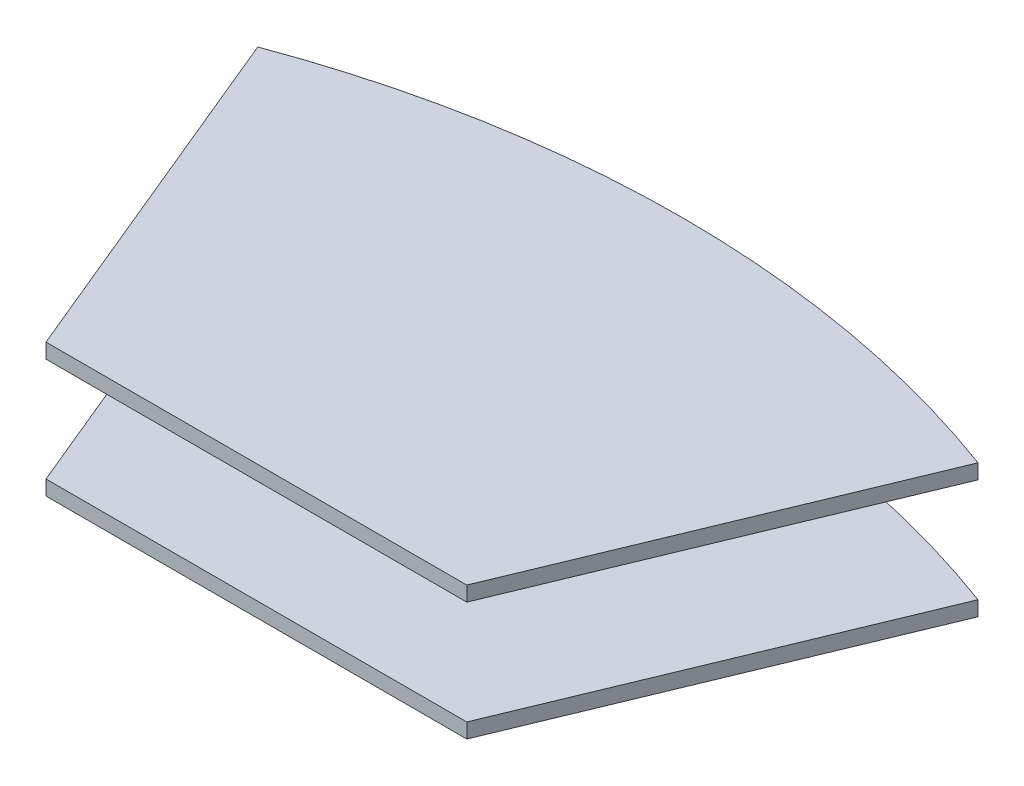
ISO-10303-21;
HEADER;
FILE_DESCRIPTION(('STEP AP214'),'2;1');
FILE_NAME('part.step','',(''),(''),'','','');
FILE_SCHEMA(('AUTOMOTIVE_DESIGN { 1 0 10303 214 1 1 1 1 }'));
ENDSEC;
DATA;
#1=APPLICATION_CONTEXT('core data for automotive mechanical design processes');
#2=APPLICATION_PROTOCOL_DEFINITION('international standard','automotive_design',2000,#1);
#3=PRODUCT_CONTEXT('',#1,'mechanical');
#4=PRODUCT('Part','Part','',(#3));
#5=PRODUCT_RELATED_PRODUCT_CATEGORY('part','',(#4));
#6=PRODUCT_DEFINITION_FORMATION('','',#4);
#7=PRODUCT_DEFINITION_CONTEXT('part definition',#1,'design');
#8=PRODUCT_DEFINITION('design','',#6,#7);
#9=PRODUCT_DEFINITION_SHAPE('','',#8);
#10=(LENGTH_UNIT() NAMED_UNIT(*) SI_UNIT(.MILLI.,.METRE.));
#11=(NAMED_UNIT(*) PLANE_ANGLE_UNIT() SI_UNIT($,.RADIAN.));
#12=(NAMED_UNIT(*) SI_UNIT($,.STERADIAN.) SOLID_ANGLE_UNIT());
#13=UNCERTAINTY_MEASURE_WITH_UNIT(LENGTH_MEASURE(1.E-05),#10,'distance_accuracy_value','');
#14=(GEOMETRIC_REPRESENTATION_CONTEXT(3) GLOBAL_UNCERTAINTY_ASSIGNED_CONTEXT((#13)) GLOBAL_UNIT_ASSIGNED_CONTEXT((#10,
#11,#12)) REPRESENTATION_CONTEXT('',''));
#15=CARTESIAN_POINT('',(0.,0.,0.));
#16=DIRECTION('',(0.,0.,1.));
#17=DIRECTION('',(1.,0.,0.));
#18=AXIS2_PLACEMENT_3D('',#15,#16,#17);
#19=CARTESIAN_POINT('',(0.,5.,281.282193031035));
#20=DIRECTION('',(0.,-1.,0.));
#21=DIRECTION('',(0.,0.,-1.));
#22=AXIS2_PLACEMENT_3D('',#19,#20,#21);
#23=CYLINDRICAL_SURFACE('',#22,350.);
#24=CARTESIAN_POINT('',(0.,0.,281.282193031035));
#25=DIRECTION('',(0.,1.,0.));
#26=DIRECTION('',(0.,0.,-1.));
#27=AXIS2_PLACEMENT_3D('',#24,#25,#26);
#28=CIRCLE('',#27,350.);
#29=CARTESIAN_POINT('',(121.5,0.,-46.9520982914898));
#30=VERTEX_POINT('',#29);
#31=CARTESIAN_POINT('',(-121.5,0.,-46.9520982914898));
#32=VERTEX_POINT('',#31);
#33=EDGE_CURVE('E239',#30,#32,#28,.T.);
#34=ORIENTED_EDGE('',*,*,#33,.T.);
#35=DIRECTION('',(0.,-1.,0.));
#36=VECTOR('',#35,1.);
#37=CARTESIAN_POINT('',(-121.5,5.,-46.9520982914898));
#38=LINE('',#37,#36);
#39=CARTESIAN_POINT('',(-121.5,5.,-46.9520982914898));
#40=VERTEX_POINT('',#39);
#41=EDGE_CURVE('E11',#40,#32,#38,.T.);
#42=ORIENTED_EDGE('',*,*,#41,.F.);
#43=CARTESIAN_POINT('',(0.,5.,281.282193031035));
#44=DIRECTION('',(0.,1.,0.));
#45=DIRECTION('',(0.,0.,-1.));
#46=AXIS2_PLACEMENT_3D('',#43,#44,#45);
#47=CIRCLE('',#46,350.);
#48=CARTESIAN_POINT('',(121.5,5.,-46.9520982914898));
#49=VERTEX_POINT('',#48);
#50=EDGE_CURVE('E240',#49,#40,#47,.T.);
#51=ORIENTED_EDGE('',*,*,#50,.F.);
#52=DIRECTION('',(0.,-1.,0.));
#53=VECTOR('',#52,1.);
#54=CARTESIAN_POINT('',(121.5,5.,-46.9520982914898));
#55=LINE('',#54,#53);
#56=EDGE_CURVE('E250',#49,#30,#55,.T.);
#57=ORIENTED_EDGE('',*,*,#56,.T.);
#58=EDGE_LOOP('',(#34,#42,#51,#57));
#59=FACE_BOUND('',#58,.T.);
#60=ADVANCED_FACE('F32',(#59),#23,.T.);
#61=CARTESIAN_POINT('',(-121.5,5.,-46.9520982914898));
#62=DIRECTION('',(0.923879532511286,0.,-0.38268343236509));
#63=DIRECTION('',(-0.382683432365091,0.,-0.923879532511287));
#64=AXIS2_PLACEMENT_3D('',#61,#62,#63);
#65=PLANE('',#64);
#66=DIRECTION('',(0.38268343236509,0.,0.923879532511286));
#67=VECTOR('',#66,1.);
#68=CARTESIAN_POINT('',(-121.5,0.,-46.9520982914898));
#69=LINE('',#68,#67);
#70=CARTESIAN_POINT('',(-70.9857869278081,0.,75.));
#71=VERTEX_POINT('',#70);
#72=EDGE_CURVE('E253',#32,#71,#69,.T.);
#73=ORIENTED_EDGE('',*,*,#72,.T.);
#74=DIRECTION('',(0.,-1.,0.));
#75=VECTOR('',#74,1.);
#76=CARTESIAN_POINT('',(-70.9857869278081,5.,75.));
#77=LINE('',#76,#75);
#78=CARTESIAN_POINT('',(-70.9857869278081,5.,75.));
#79=VERTEX_POINT('',#78);
#80=EDGE_CURVE('E39',#79,#71,#77,.T.);
#81=ORIENTED_EDGE('',*,*,#80,.F.);
#82=DIRECTION('',(0.38268343236509,0.,0.923879532511286));
#83=VECTOR('',#82,1.);
#84=CARTESIAN_POINT('',(-121.5,5.,-46.9520982914898));
#85=LINE('',#84,#83);
#86=EDGE_CURVE('E243',#40,#79,#85,.T.);
#87=ORIENTED_EDGE('',*,*,#86,.F.);
#88=ORIENTED_EDGE('',*,*,#41,.T.);
#89=EDGE_LOOP('',(#73,#81,#87,#88));
#90=FACE_BOUND('',#89,.T.);
#91=ADVANCED_FACE('F283',(#90),#65,.F.);
#92=CARTESIAN_POINT('',(-70.9857869278081,5.,75.));
#93=DIRECTION('',(0.,0.,-1.));
#94=DIRECTION('',(-1.,0.,0.));
#95=AXIS2_PLACEMENT_3D('',#92,#93,#94);
#96=PLANE('',#95);
#97=DIRECTION('',(1.,0.,0.));
#98=VECTOR('',#97,1.);
#99=CARTESIAN_POINT('',(-70.9857869278081,0.,75.));
#100=LINE('',#99,#98);
#101=CARTESIAN_POINT('',(70.9857869278081,0.,75.));
#102=VERTEX_POINT('',#101);
#103=EDGE_CURVE('E255',#71,#102,#100,.T.);
#104=ORIENTED_EDGE('',*,*,#103,.T.);
#105=DIRECTION('',(0.,-1.,0.));
#106=VECTOR('',#105,1.);
#107=CARTESIAN_POINT('',(70.9857869278081,5.,75.));
#108=LINE('',#107,#106);
#109=CARTESIAN_POINT('',(70.9857869278081,5.,75.));
#110=VERTEX_POINT('',#109);
#111=EDGE_CURVE('E260',#110,#102,#108,.T.);
#112=ORIENTED_EDGE('',*,*,#111,.F.);
#113=DIRECTION('',(1.,0.,0.));
#114=VECTOR('',#113,1.);
#115=CARTESIAN_POINT('',(-70.9857869278081,5.,75.));
#116=LINE('',#115,#114);
#117=EDGE_CURVE('E246',#79,#110,#116,.T.);
#118=ORIENTED_EDGE('',*,*,#117,.F.);
#119=ORIENTED_EDGE('',*,*,#80,.T.);
#120=EDGE_LOOP('',(#104,#112,#118,#119));
#121=FACE_BOUND('',#120,.T.);
#122=ADVANCED_FACE('F267',(#121),#96,.F.);
#123=CARTESIAN_POINT('',(121.5,5.,-46.9520982914898));
#124=DIRECTION('',(-0.923879532511287,0.,-0.38268343236509));
#125=DIRECTION('',(-0.38268343236509,0.,0.923879532511287));
#126=AXIS2_PLACEMENT_3D('',#123,#124,#125);
#127=PLANE('',#126);
#128=DIRECTION('',(0.38268343236509,0.,-0.923879532511287));
#129=VECTOR('',#128,1.);
#130=CARTESIAN_POINT('',(121.5,0.,-46.9520982914898));
#131=LINE('',#130,#129);
#132=EDGE_CURVE('E244',#102,#30,#131,.T.);
#133=ORIENTED_EDGE('',*,*,#132,.T.);
#134=ORIENTED_EDGE('',*,*,#56,.F.);
#135=DIRECTION('',(0.38268343236509,0.,-0.923879532511287));
#136=VECTOR('',#135,1.);
#137=CARTESIAN_POINT('',(121.5,5.,-46.9520982914898));
#138=LINE('',#137,#136);
#139=EDGE_CURVE('E248',#110,#49,#138,.T.);
#140=ORIENTED_EDGE('',*,*,#139,.F.);
#141=ORIENTED_EDGE('',*,*,#111,.T.);
#142=EDGE_LOOP('',(#133,#134,#140,#141));
#143=FACE_BOUND('',#142,.T.);
#144=ADVANCED_FACE('F276',(#143),#127,.F.);
#145=CARTESIAN_POINT('',(0.,5.,281.282193031035));
#146=DIRECTION('',(0.,-1.,0.));
#147=DIRECTION('',(0.,0.,-1.));
#148=AXIS2_PLACEMENT_3D('',#145,#146,#147);
#149=PLANE('',#148);
#150=CARTESIAN_POINT('',(39.5944346456873,5.,-6.0021273644374));
#151=DIRECTION('',(0.,1.,0.));
#152=DIRECTION('',(0.,0.,-1.));
#153=AXIS2_PLACEMENT_3D('',#150,#151,#152);
#154=CIRCLE('',#153,9.99999999999999);
#155=CARTESIAN_POINT('',(48.8332299708001,5.,-2.17529304078651));
#156=VERTEX_POINT('',#155);
#157=CARTESIAN_POINT('',(40.9597599782972,5.,-15.9084832401434));
#158=VERTEX_POINT('',#157);
#159=EDGE_CURVE('E46',#156,#158,#154,.T.);
#160=ORIENTED_EDGE('',*,*,#159,.F.);
#161=DIRECTION('',(0.38268343236509,0.,-0.923879532511287));
#162=VECTOR('',#161,1.);
#163=CARTESIAN_POINT('',(40.1338639777631,5.,18.8268343236508));
#164=LINE('',#163,#162);
#165=CARTESIAN_POINT('',(40.1338639777631,5.,18.8268343236508));
#166=VERTEX_POINT('',#165);
#167=EDGE_CURVE('E50',#166,#156,#164,.T.);
#168=ORIENTED_EDGE('',*,*,#167,.F.);
#169=CARTESIAN_POINT('',(30.8950686526502,5.,15.));
#170=DIRECTION('',(0.,1.,0.));
#171=DIRECTION('',(0.,0.,-1.));
#172=AXIS2_PLACEMENT_3D('',#169,#170,#171);
#173=CIRCLE('',#172,10.);
#174=CARTESIAN_POINT('',(30.8950686526501,5.,25.));
#175=VERTEX_POINT('',#174);
#176=EDGE_CURVE('E213',#175,#166,#173,.T.);
#177=ORIENTED_EDGE('',*,*,#176,.F.);
#178=DIRECTION('',(1.,0.,0.));
#179=VECTOR('',#178,1.);
#180=CARTESIAN_POINT('',(-30.8950686526501,5.,25.));
#181=LINE('',#180,#179);
#182=CARTESIAN_POINT('',(-30.8950686526502,5.,25.));
#183=VERTEX_POINT('',#182);
#184=EDGE_CURVE('E210',#183,#175,#181,.T.);
#185=ORIENTED_EDGE('',*,*,#184,.F.);
#186=CARTESIAN_POINT('',(-30.8950686526502,5.,15.));
#187=DIRECTION('',(0.,1.,0.));
#188=DIRECTION('',(0.,0.,1.));
#189=AXIS2_PLACEMENT_3D('',#186,#187,#188);
#190=CIRCLE('',#189,10.);
#191=CARTESIAN_POINT('',(-40.1338639777631,5.,18.8268343236508));
#192=VERTEX_POINT('',#191);
#193=EDGE_CURVE('E207',#192,#183,#190,.T.);
#194=ORIENTED_EDGE('',*,*,#193,.F.);
#195=DIRECTION('',(0.38268343236509,0.,0.923879532511287));
#196=VECTOR('',#195,1.);
#197=CARTESIAN_POINT('',(-48.8332299708002,5.,-2.17529304078656));
#198=LINE('',#197,#196);
#199=CARTESIAN_POINT('',(-48.8332299708002,5.,-2.17529304078655));
#200=VERTEX_POINT('',#199);
#201=EDGE_CURVE('E204',#200,#192,#198,.T.);
#202=ORIENTED_EDGE('',*,*,#201,.F.);
#203=CARTESIAN_POINT('',(-39.5944346456873,5.,-6.00212736443746));
#204=DIRECTION('',(0.,1.,0.));
#205=DIRECTION('',(0.,0.,-1.));
#206=AXIS2_PLACEMENT_3D('',#203,#204,#205);
#207=CIRCLE('',#206,10.);
#208=CARTESIAN_POINT('',(-40.9597599782972,5.,-15.9084832401434));
#209=VERTEX_POINT('',#208);
#210=EDGE_CURVE('E201',#209,#200,#207,.T.);
#211=ORIENTED_EDGE('',*,*,#210,.F.);
#212=CARTESIAN_POINT('',(0.,5.,281.282193031035));
#213=DIRECTION('',(0.,1.,0.));
#214=DIRECTION('',(0.,0.,1.));
#215=AXIS2_PLACEMENT_3D('',#212,#213,#214);
#216=CIRCLE('',#215,300.);
#217=EDGE_CURVE('E168',#158,#209,#216,.T.);
#218=ORIENTED_EDGE('',*,*,#217,.F.);
#219=EDGE_LOOP('',(#160,#168,#177,#185,#194,#202,#211,#218));
#220=FACE_BOUND('',#219,.T.);
#221=ORIENTED_EDGE('',*,*,#50,.T.);
#222=ORIENTED_EDGE('',*,*,#86,.T.);
#223=ORIENTED_EDGE('',*,*,#117,.T.);
#224=ORIENTED_EDGE('',*,*,#139,.T.);
#225=EDGE_LOOP('',(#221,#222,#223,#224));
#226=FACE_BOUND('',#225,.T.);
#227=ADVANCED_FACE('F282',(#220,#226),#149,.F.);
#228=CARTESIAN_POINT('',(0.,0.,281.282193031035));
#229=DIRECTION('',(0.,-1.,0.));
#230=DIRECTION('',(0.,0.,-1.));
#231=AXIS2_PLACEMENT_3D('',#228,#229,#230);
#232=PLANE('',#231);
#233=ORIENTED_EDGE('',*,*,#33,.F.);
#234=ORIENTED_EDGE('',*,*,#132,.F.);
#235=ORIENTED_EDGE('',*,*,#103,.F.);
#236=ORIENTED_EDGE('',*,*,#72,.F.);
#237=EDGE_LOOP('',(#233,#234,#235,#236));
#238=FACE_BOUND('',#237,.T.);
#239=ADVANCED_FACE('F273',(#238),#232,.T.);
#240=CARTESIAN_POINT('',(39.5944346456873,40.,-6.0021273644374));
#241=DIRECTION('',(0.,-1.,0.));
#242=DIRECTION('',(0.,0.,-1.));
#243=AXIS2_PLACEMENT_3D('',#240,#241,#242);
#244=CYLINDRICAL_SURFACE('',#243,9.99999999999999);
#245=ORIENTED_EDGE('',*,*,#159,.T.);
#246=DIRECTION('',(0.,-1.,0.));
#247=VECTOR('',#246,1.);
#248=CARTESIAN_POINT('',(40.9597599782972,40.,-15.9084832401434));
#249=LINE('',#248,#247);
#250=CARTESIAN_POINT('',(40.9597599782972,40.,-15.9084832401434));
#251=VERTEX_POINT('',#250);
#252=EDGE_CURVE('E236',#251,#158,#249,.T.);
#253=ORIENTED_EDGE('',*,*,#252,.F.);
#254=CARTESIAN_POINT('',(39.5944346456873,40.,-6.0021273644374));
#255=DIRECTION('',(0.,1.,0.));
#256=DIRECTION('',(0.,0.,-1.));
#257=AXIS2_PLACEMENT_3D('',#254,#255,#256);
#258=CIRCLE('',#257,9.99999999999999);
#259=CARTESIAN_POINT('',(48.8332299708001,40.,-2.17529304078651));
#260=VERTEX_POINT('',#259);
#261=EDGE_CURVE('E174',#260,#251,#258,.T.);
#262=ORIENTED_EDGE('',*,*,#261,.F.);
#263=DIRECTION('',(0.,-1.,0.));
#264=VECTOR('',#263,1.);
#265=CARTESIAN_POINT('',(48.8332299708001,40.,-2.17529304078651));
#266=LINE('',#265,#264);
#267=EDGE_CURVE('E197',#260,#156,#266,.T.);
#268=ORIENTED_EDGE('',*,*,#267,.T.);
#269=EDGE_LOOP('',(#245,#253,#262,#268));
#270=FACE_BOUND('',#269,.T.);
#271=ADVANCED_FACE('F295',(#270),#244,.T.);
#272=CARTESIAN_POINT('',(0.,40.,281.282193031035));
#273=DIRECTION('',(0.,-1.,0.));
#274=DIRECTION('',(0.,0.,-1.));
#275=AXIS2_PLACEMENT_3D('',#272,#273,#274);
#276=CYLINDRICAL_SURFACE('',#275,300.);
#277=ORIENTED_EDGE('',*,*,#217,.T.);
#278=DIRECTION('',(0.,-1.,0.));
#279=VECTOR('',#278,1.);
#280=CARTESIAN_POINT('',(-40.9597599782972,40.,-15.9084832401434));
#281=LINE('',#280,#279);
#282=CARTESIAN_POINT('',(-40.9597599782972,40.,-15.9084832401434));
#283=VERTEX_POINT('',#282);
#284=EDGE_CURVE('E233',#283,#209,#281,.T.);
#285=ORIENTED_EDGE('',*,*,#284,.F.);
#286=CARTESIAN_POINT('',(0.,40.,281.282193031035));
#287=DIRECTION('',(0.,1.,0.));
#288=DIRECTION('',(0.,0.,1.));
#289=AXIS2_PLACEMENT_3D('',#286,#287,#288);
#290=CIRCLE('',#289,300.);
#291=EDGE_CURVE('E177',#251,#283,#290,.T.);
#292=ORIENTED_EDGE('',*,*,#291,.F.);
#293=ORIENTED_EDGE('',*,*,#252,.T.);
#294=EDGE_LOOP('',(#277,#285,#292,#293));
#295=FACE_BOUND('',#294,.T.);
#296=ADVANCED_FACE('F300',(#295),#276,.T.);
#297=CARTESIAN_POINT('',(-39.5944346456873,40.,-6.00212736443746));
#298=DIRECTION('',(0.,-1.,0.));
#299=DIRECTION('',(0.,0.,-1.));
#300=AXIS2_PLACEMENT_3D('',#297,#298,#299);
#301=CYLINDRICAL_SURFACE('',#300,10.);
#302=ORIENTED_EDGE('',*,*,#210,.T.);
#303=DIRECTION('',(0.,-1.,0.));
#304=VECTOR('',#303,1.);
#305=CARTESIAN_POINT('',(-48.8332299708002,40.,-2.17529304078655));
#306=LINE('',#305,#304);
#307=CARTESIAN_POINT('',(-48.8332299708002,40.,-2.17529304078655));
#308=VERTEX_POINT('',#307);
#309=EDGE_CURVE('E230',#308,#200,#306,.T.);
#310=ORIENTED_EDGE('',*,*,#309,.F.);
#311=CARTESIAN_POINT('',(-39.5944346456873,40.,-6.00212736443746));
#312=DIRECTION('',(0.,1.,0.));
#313=DIRECTION('',(0.,0.,-1.));
#314=AXIS2_PLACEMENT_3D('',#311,#312,#313);
#315=CIRCLE('',#314,10.);
#316=EDGE_CURVE('E180',#283,#308,#315,.T.);
#317=ORIENTED_EDGE('',*,*,#316,.F.);
#318=ORIENTED_EDGE('',*,*,#284,.T.);
#319=EDGE_LOOP('',(#302,#310,#317,#318));
#320=FACE_BOUND('',#319,.T.);
#321=ADVANCED_FACE('F304',(#320),#301,.T.);
#322=CARTESIAN_POINT('',(-48.8332299708002,40.,-2.17529304078656));
#323=DIRECTION('',(0.923879532511287,0.,-0.38268343236509));
#324=DIRECTION('',(-0.38268343236509,0.,-0.923879532511287));
#325=AXIS2_PLACEMENT_3D('',#322,#323,#324);
#326=PLANE('',#325);
#327=ORIENTED_EDGE('',*,*,#201,.T.);
#328=DIRECTION('',(0.,-1.,0.));
#329=VECTOR('',#328,1.);
#330=CARTESIAN_POINT('',(-40.1338639777631,40.,18.8268343236508));
#331=LINE('',#330,#329);
#332=CARTESIAN_POINT('',(-40.1338639777631,40.,18.8268343236508));
#333=VERTEX_POINT('',#332);
#334=EDGE_CURVE('E227',#333,#192,#331,.T.);
#335=ORIENTED_EDGE('',*,*,#334,.F.);
#336=DIRECTION('',(0.38268343236509,0.,0.923879532511287));
#337=VECTOR('',#336,1.);
#338=CARTESIAN_POINT('',(-48.8332299708002,40.,-2.17529304078656));
#339=LINE('',#338,#337);
#340=EDGE_CURVE('E183',#308,#333,#339,.T.);
#341=ORIENTED_EDGE('',*,*,#340,.F.);
#342=ORIENTED_EDGE('',*,*,#309,.T.);
#343=EDGE_LOOP('',(#327,#335,#341,#342));
#344=FACE_BOUND('',#343,.T.);
#345=ADVANCED_FACE('F308',(#344),#326,.F.);
#346=CARTESIAN_POINT('',(-30.8950686526502,40.,15.));
#347=DIRECTION('',(0.,-1.,0.));
#348=DIRECTION('',(0.,0.,-1.));
#349=AXIS2_PLACEMENT_3D('',#346,#347,#348);
#350=CYLINDRICAL_SURFACE('',#349,10.);
#351=ORIENTED_EDGE('',*,*,#193,.T.);
#352=DIRECTION('',(0.,-1.,0.));
#353=VECTOR('',#352,1.);
#354=CARTESIAN_POINT('',(-30.8950686526502,40.,25.));
#355=LINE('',#354,#353);
#356=CARTESIAN_POINT('',(-30.8950686526502,40.,25.));
#357=VERTEX_POINT('',#356);
#358=EDGE_CURVE('E224',#357,#183,#355,.T.);
#359=ORIENTED_EDGE('',*,*,#358,.F.);
#360=CARTESIAN_POINT('',(-30.8950686526502,40.,15.));
#361=DIRECTION('',(0.,1.,0.));
#362=DIRECTION('',(0.,0.,1.));
#363=AXIS2_PLACEMENT_3D('',#360,#361,#362);
#364=CIRCLE('',#363,10.);
#365=EDGE_CURVE('E186',#333,#357,#364,.T.);
#366=ORIENTED_EDGE('',*,*,#365,.F.);
#367=ORIENTED_EDGE('',*,*,#334,.T.);
#368=EDGE_LOOP('',(#351,#359,#366,#367));
#369=FACE_BOUND('',#368,.T.);
#370=ADVANCED_FACE('F312',(#369),#350,.T.);
#371=CARTESIAN_POINT('',(-30.8950686526501,40.,25.));
#372=DIRECTION('',(0.,0.,-1.));
#373=DIRECTION('',(-1.,0.,0.));
#374=AXIS2_PLACEMENT_3D('',#371,#372,#373);
#375=PLANE('',#374);
#376=ORIENTED_EDGE('',*,*,#184,.T.);
#377=DIRECTION('',(0.,-1.,0.));
#378=VECTOR('',#377,1.);
#379=CARTESIAN_POINT('',(30.8950686526501,40.,25.));
#380=LINE('',#379,#378);
#381=CARTESIAN_POINT('',(30.8950686526501,40.,25.));
#382=VERTEX_POINT('',#381);
#383=EDGE_CURVE('E221',#382,#175,#380,.T.);
#384=ORIENTED_EDGE('',*,*,#383,.F.);
#385=DIRECTION('',(1.,0.,0.));
#386=VECTOR('',#385,1.);
#387=CARTESIAN_POINT('',(-30.8950686526501,40.,25.));
#388=LINE('',#387,#386);
#389=EDGE_CURVE('E189',#357,#382,#388,.T.);
#390=ORIENTED_EDGE('',*,*,#389,.F.);
#391=ORIENTED_EDGE('',*,*,#358,.T.);
#392=EDGE_LOOP('',(#376,#384,#390,#391));
#393=FACE_BOUND('',#392,.T.);
#394=ADVANCED_FACE('F316',(#393),#375,.F.);
#395=CARTESIAN_POINT('',(30.8950686526502,40.,15.));
#396=DIRECTION('',(0.,-1.,0.));
#397=DIRECTION('',(0.,0.,-1.));
#398=AXIS2_PLACEMENT_3D('',#395,#396,#397);
#399=CYLINDRICAL_SURFACE('',#398,10.);
#400=ORIENTED_EDGE('',*,*,#176,.T.);
#401=DIRECTION('',(0.,-1.,0.));
#402=VECTOR('',#401,1.);
#403=CARTESIAN_POINT('',(40.1338639777631,40.,18.8268343236508));
#404=LINE('',#403,#402);
#405=CARTESIAN_POINT('',(40.1338639777631,40.,18.8268343236508));
#406=VERTEX_POINT('',#405);
#407=EDGE_CURVE('E218',#406,#166,#404,.T.);
#408=ORIENTED_EDGE('',*,*,#407,.F.);
#409=CARTESIAN_POINT('',(30.8950686526502,40.,15.));
#410=DIRECTION('',(0.,1.,0.));
#411=DIRECTION('',(0.,0.,-1.));
#412=AXIS2_PLACEMENT_3D('',#409,#410,#411);
#413=CIRCLE('',#412,10.);
#414=EDGE_CURVE('E192',#382,#406,#413,.T.);
#415=ORIENTED_EDGE('',*,*,#414,.F.);
#416=ORIENTED_EDGE('',*,*,#383,.T.);
#417=EDGE_LOOP('',(#400,#408,#415,#416));
#418=FACE_BOUND('',#417,.T.);
#419=ADVANCED_FACE('F320',(#418),#399,.T.);
#420=CARTESIAN_POINT('',(40.1338639777631,40.,18.8268343236508));
#421=DIRECTION('',(-0.923879532511287,0.,-0.382683432365089));
#422=DIRECTION('',(-0.382683432365089,0.,0.923879532511287));
#423=AXIS2_PLACEMENT_3D('',#420,#421,#422);
#424=PLANE('',#423);
#425=ORIENTED_EDGE('',*,*,#167,.T.);
#426=ORIENTED_EDGE('',*,*,#267,.F.);
#427=DIRECTION('',(0.38268343236509,0.,-0.923879532511287));
#428=VECTOR('',#427,1.);
#429=CARTESIAN_POINT('',(40.1338639777631,40.,18.8268343236508));
#430=LINE('',#429,#428);
#431=EDGE_CURVE('E195',#406,#260,#430,.T.);
#432=ORIENTED_EDGE('',*,*,#431,.F.);
#433=ORIENTED_EDGE('',*,*,#407,.T.);
#434=EDGE_LOOP('',(#425,#426,#432,#433));
#435=FACE_BOUND('',#434,.T.);
#436=ADVANCED_FACE('F324',(#435),#424,.F.);
#437=CARTESIAN_POINT('',(0.,40.,281.282193031035));
#438=DIRECTION('',(0.,1.,0.));
#439=DIRECTION('',(0.,0.,1.));
#440=AXIS2_PLACEMENT_3D('',#437,#438,#439);
#441=PLANE('',#440);
#442=CARTESIAN_POINT('',(0.,40.,281.282193031035));
#443=DIRECTION('',(0.,1.,0.));
#444=DIRECTION('',(0.,0.,1.));
#445=AXIS2_PLACEMENT_3D('',#442,#443,#444);
#446=CIRCLE('',#445,350.);
#447=CARTESIAN_POINT('',(121.5,40.,-46.9520982914898));
#448=VERTEX_POINT('',#447);
#449=CARTESIAN_POINT('',(-121.5,40.,-46.9520982914898));
#450=VERTEX_POINT('',#449);
#451=EDGE_CURVE('E166',#448,#450,#446,.T.);
#452=ORIENTED_EDGE('',*,*,#451,.F.);
#453=DIRECTION('',(0.38268343236509,0.,-0.923879532511287));
#454=VECTOR('',#453,1.);
#455=CARTESIAN_POINT('',(70.9857869278081,40.,75.));
#456=LINE('',#455,#454);
#457=CARTESIAN_POINT('',(70.9857869278081,40.,75.));
#458=VERTEX_POINT('',#457);
#459=EDGE_CURVE('E162',#458,#448,#456,.T.);
#460=ORIENTED_EDGE('',*,*,#459,.F.);
#461=DIRECTION('',(1.,0.,0.));
#462=VECTOR('',#461,1.);
#463=CARTESIAN_POINT('',(-70.9857869278081,40.,75.));
#464=LINE('',#463,#462);
#465=CARTESIAN_POINT('',(-70.9857869278081,40.,75.));
#466=VERTEX_POINT('',#465);
#467=EDGE_CURVE('E477',#466,#458,#464,.T.);
#468=ORIENTED_EDGE('',*,*,#467,.F.);
#469=DIRECTION('',(0.382683432365091,0.,0.923879532511286));
#470=VECTOR('',#469,1.);
#471=CARTESIAN_POINT('',(-121.5,40.,-46.9520982914898));
#472=LINE('',#471,#470);
#473=EDGE_CURVE('E475',#450,#466,#472,.T.);
#474=ORIENTED_EDGE('',*,*,#473,.F.);
#475=EDGE_LOOP('',(#452,#460,#468,#474));
#476=FACE_BOUND('',#475,.T.);
#477=ORIENTED_EDGE('',*,*,#431,.T.);
#478=ORIENTED_EDGE('',*,*,#261,.T.);
#479=ORIENTED_EDGE('',*,*,#291,.T.);
#480=ORIENTED_EDGE('',*,*,#316,.T.);
#481=ORIENTED_EDGE('',*,*,#340,.T.);
#482=ORIENTED_EDGE('',*,*,#365,.T.);
#483=ORIENTED_EDGE('',*,*,#389,.T.);
#484=ORIENTED_EDGE('',*,*,#414,.T.);
#485=EDGE_LOOP('',(#477,#478,#479,#480,#481,#482,#483,#484));
#486=FACE_BOUND('',#485,.T.);
#487=ADVANCED_FACE('F328',(#476,#486),#441,.F.);
#488=CARTESIAN_POINT('',(0.,45.,281.282193031035));
#489=DIRECTION('',(0.,-1.,0.));
#490=DIRECTION('',(0.,0.,-1.));
#491=AXIS2_PLACEMENT_3D('',#488,#489,#490);
#492=CYLINDRICAL_SURFACE('',#491,350.);
#493=ORIENTED_EDGE('',*,*,#451,.T.);
#494=DIRECTION('',(0.,-1.,0.));
#495=VECTOR('',#494,1.);
#496=CARTESIAN_POINT('',(-121.5,45.,-46.9520982914898));
#497=LINE('',#496,#495);
#498=CARTESIAN_POINT('',(-121.5,45.,-46.9520982914898));
#499=VERTEX_POINT('',#498);
#500=EDGE_CURVE('E146',#499,#450,#497,.T.);
#501=ORIENTED_EDGE('',*,*,#500,.F.);
#502=CARTESIAN_POINT('',(0.,45.,281.282193031035));
#503=DIRECTION('',(0.,1.,0.));
#504=DIRECTION('',(0.,0.,1.));
#505=AXIS2_PLACEMENT_3D('',#502,#503,#504);
#506=CIRCLE('',#505,350.);
#507=CARTESIAN_POINT('',(121.5,45.,-46.9520982914898));
#508=VERTEX_POINT('',#507);
#509=EDGE_CURVE('E153',#508,#499,#506,.T.);
#510=ORIENTED_EDGE('',*,*,#509,.F.);
#511=DIRECTION('',(0.,-1.,0.));
#512=VECTOR('',#511,1.);
#513=CARTESIAN_POINT('',(121.5,45.,-46.9520982914898));
#514=LINE('',#513,#512);
#515=EDGE_CURVE('E484',#508,#448,#514,.T.);
#516=ORIENTED_EDGE('',*,*,#515,.T.);
#517=EDGE_LOOP('',(#493,#501,#510,#516));
#518=FACE_BOUND('',#517,.T.);
#519=ADVANCED_FACE('F164',(#518),#492,.T.);
#520=CARTESIAN_POINT('',(-121.5,45.,-46.9520982914898));
#521=DIRECTION('',(0.923879532511286,0.,-0.382683432365091));
#522=DIRECTION('',(-0.382683432365091,0.,-0.923879532511287));
#523=AXIS2_PLACEMENT_3D('',#520,#521,#522);
#524=PLANE('',#523);
#525=ORIENTED_EDGE('',*,*,#473,.T.);
#526=DIRECTION('',(0.,-1.,0.));
#527=VECTOR('',#526,1.);
#528=CARTESIAN_POINT('',(-70.9857869278081,45.,75.));
#529=LINE('',#528,#527);
#530=CARTESIAN_POINT('',(-70.9857869278081,45.,75.));
#531=VERTEX_POINT('',#530);
#532=EDGE_CURVE('E149',#531,#466,#529,.T.);
#533=ORIENTED_EDGE('',*,*,#532,.F.);
#534=DIRECTION('',(0.382683432365091,0.,0.923879532511286));
#535=VECTOR('',#534,1.);
#536=CARTESIAN_POINT('',(-121.5,45.,-46.9520982914898));
#537=LINE('',#536,#535);
#538=EDGE_CURVE('E142',#499,#531,#537,.T.);
#539=ORIENTED_EDGE('',*,*,#538,.F.);
#540=ORIENTED_EDGE('',*,*,#500,.T.);
#541=EDGE_LOOP('',(#525,#533,#539,#540));
#542=FACE_BOUND('',#541,.T.);
#543=ADVANCED_FACE('F144',(#542),#524,.F.);
#544=CARTESIAN_POINT('',(-70.9857869278081,45.,75.));
#545=DIRECTION('',(0.,0.,-1.));
#546=DIRECTION('',(-1.,0.,0.));
#547=AXIS2_PLACEMENT_3D('',#544,#545,#546);
#548=PLANE('',#547);
#549=ORIENTED_EDGE('',*,*,#467,.T.);
#550=DIRECTION('',(0.,-1.,0.));
#551=VECTOR('',#550,1.);
#552=CARTESIAN_POINT('',(70.9857869278081,45.,75.));
#553=LINE('',#552,#551);
#554=CARTESIAN_POINT('',(70.9857869278081,45.,75.));
#555=VERTEX_POINT('',#554);
#556=EDGE_CURVE('E170',#555,#458,#553,.T.);
#557=ORIENTED_EDGE('',*,*,#556,.F.);
#558=DIRECTION('',(1.,0.,0.));
#559=VECTOR('',#558,1.);
#560=CARTESIAN_POINT('',(-70.9857869278081,45.,75.));
#561=LINE('',#560,#559);
#562=EDGE_CURVE('E152',#531,#555,#561,.T.);
#563=ORIENTED_EDGE('',*,*,#562,.F.);
#564=ORIENTED_EDGE('',*,*,#532,.T.);
#565=EDGE_LOOP('',(#549,#557,#563,#564));
#566=FACE_BOUND('',#565,.T.);
#567=ADVANCED_FACE('F334',(#566),#548,.F.);
#568=CARTESIAN_POINT('',(70.9857869278081,45.,75.));
#569=DIRECTION('',(-0.923879532511287,0.,-0.38268343236509));
#570=DIRECTION('',(-0.38268343236509,0.,0.923879532511287));
#571=AXIS2_PLACEMENT_3D('',#568,#569,#570);
#572=PLANE('',#571);
#573=ORIENTED_EDGE('',*,*,#459,.T.);
#574=ORIENTED_EDGE('',*,*,#515,.F.);
#575=DIRECTION('',(0.38268343236509,0.,-0.923879532511287));
#576=VECTOR('',#575,1.);
#577=CARTESIAN_POINT('',(70.9857869278081,45.,75.));
#578=LINE('',#577,#576);
#579=EDGE_CURVE('E158',#555,#508,#578,.T.);
#580=ORIENTED_EDGE('',*,*,#579,.F.);
#581=ORIENTED_EDGE('',*,*,#556,.T.);
#582=EDGE_LOOP('',(#573,#574,#580,#581));
#583=FACE_BOUND('',#582,.T.);
#584=ADVANCED_FACE('F337',(#583),#572,.F.);
#585=CARTESIAN_POINT('',(0.,45.,281.282193031035));
#586=DIRECTION('',(0.,1.,0.));
#587=DIRECTION('',(0.,0.,1.));
#588=AXIS2_PLACEMENT_3D('',#585,#586,#587);
#589=PLANE('',#588);
#590=ORIENTED_EDGE('',*,*,#509,.T.);
#591=ORIENTED_EDGE('',*,*,#538,.T.);
#592=ORIENTED_EDGE('',*,*,#562,.T.);
#593=ORIENTED_EDGE('',*,*,#579,.T.);
#594=EDGE_LOOP('',(#590,#591,#592,#593));
#595=FACE_BOUND('',#594,.T.);
#596=ADVANCED_FACE('F156',(#595),#589,.T.);
#597=CLOSED_SHELL('',(#60,#91,#122,#144,#227,#239,#271,#296,#321,#345,#370,#394,#419,#436,#487,
#519,#543,#567,#584,#596));
#598=MANIFOLD_SOLID_BREP('B2',#597);
#599=ADVANCED_BREP_SHAPE_REPRESENTATION('',(#18,#598),#14);
#600=SHAPE_DEFINITION_REPRESENTATION(#9,#599);
ENDSEC;
END-ISO-10303-21;
